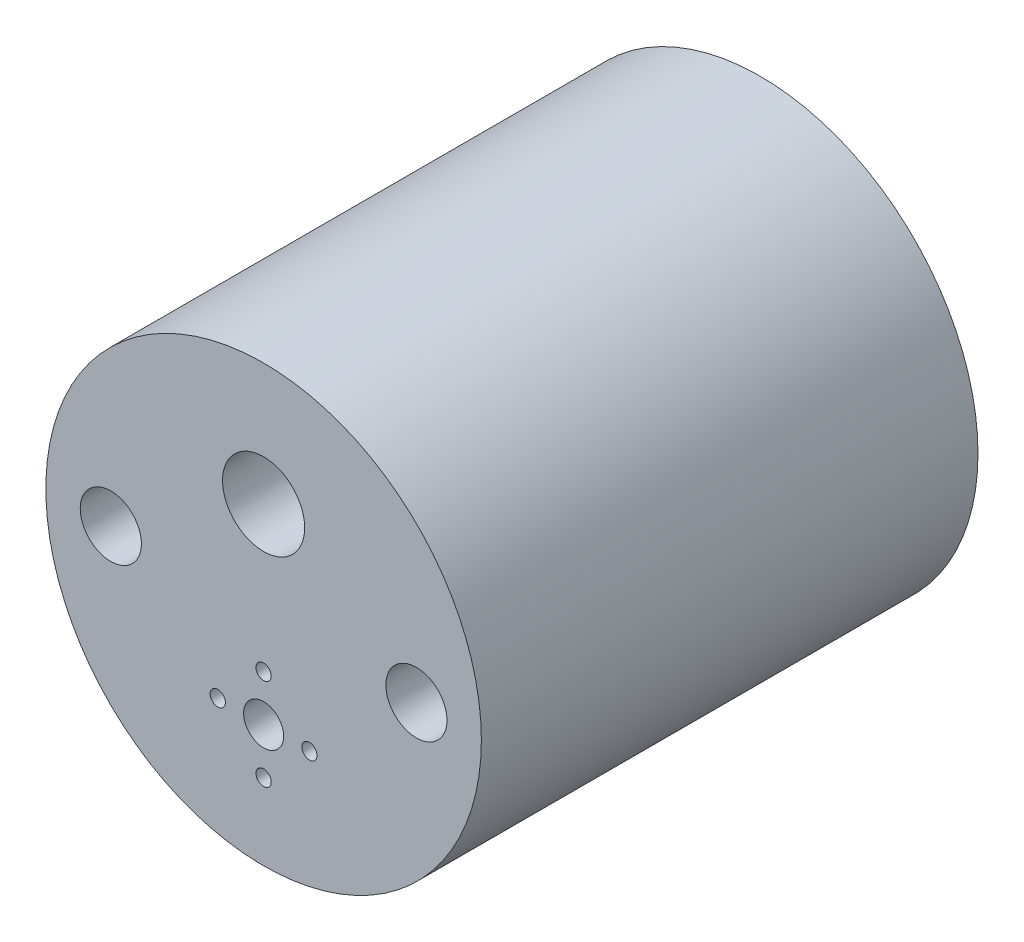
ISO-10303-21;
HEADER;
FILE_DESCRIPTION(('STEP AP214'),'2;1');
FILE_NAME('part.step','',(''),(''),'','','');
FILE_SCHEMA(('AUTOMOTIVE_DESIGN { 1 0 10303 214 1 1 1 1 }'));
ENDSEC;
DATA;
#1=APPLICATION_CONTEXT('core data for automotive mechanical design processes');
#2=APPLICATION_PROTOCOL_DEFINITION('international standard','automotive_design',2000,#1);
#3=PRODUCT_CONTEXT('',#1,'mechanical');
#4=PRODUCT('Part','Part','',(#3));
#5=PRODUCT_RELATED_PRODUCT_CATEGORY('part','',(#4));
#6=PRODUCT_DEFINITION_FORMATION('','',#4);
#7=PRODUCT_DEFINITION_CONTEXT('part definition',#1,'design');
#8=PRODUCT_DEFINITION('design','',#6,#7);
#9=PRODUCT_DEFINITION_SHAPE('','',#8);
#10=(LENGTH_UNIT() NAMED_UNIT(*) SI_UNIT(.MILLI.,.METRE.));
#11=(NAMED_UNIT(*) PLANE_ANGLE_UNIT() SI_UNIT($,.RADIAN.));
#12=(NAMED_UNIT(*) SI_UNIT($,.STERADIAN.) SOLID_ANGLE_UNIT());
#13=UNCERTAINTY_MEASURE_WITH_UNIT(LENGTH_MEASURE(1.E-05),#10,'distance_accuracy_value','');
#14=(GEOMETRIC_REPRESENTATION_CONTEXT(3) GLOBAL_UNCERTAINTY_ASSIGNED_CONTEXT((#13)) GLOBAL_UNIT_ASSIGNED_CONTEXT((#10,
#11,#12)) REPRESENTATION_CONTEXT('',''));
#15=CARTESIAN_POINT('',(0.,0.,0.));
#16=DIRECTION('',(0.,0.,1.));
#17=DIRECTION('',(1.,0.,0.));
#18=AXIS2_PLACEMENT_3D('',#15,#16,#17);
#19=CARTESIAN_POINT('',(-40.0000000000001,25.0000000000002,-19.5));
#20=DIRECTION('',(0.,0.,1.));
#21=DIRECTION('',(1.,0.,0.));
#22=AXIS2_PLACEMENT_3D('',#19,#20,#21);
#23=CYLINDRICAL_SURFACE('',#22,8.);
#24=CARTESIAN_POINT('',(-40.0000000000001,25.0000000000002,0.));
#25=DIRECTION('',(0.,0.,-1.));
#26=DIRECTION('',(-1.,0.,0.));
#27=AXIS2_PLACEMENT_3D('',#24,#25,#26);
#28=CIRCLE('',#27,8.);
#29=CARTESIAN_POINT('',(-48.0000000000001,25.0000000000002,0.));
#30=VERTEX_POINT('',#29);
#31=EDGE_CURVE('E123',#30,#30,#28,.T.);
#32=ORIENTED_EDGE('',*,*,#31,.F.);
#33=EDGE_LOOP('',(#32));
#34=FACE_BOUND('',#33,.T.);
#35=CARTESIAN_POINT('',(-40.0000000000001,25.0000000000002,-13.95));
#36=DIRECTION('',(0.,0.,-1.));
#37=DIRECTION('',(-1.,0.,0.));
#38=AXIS2_PLACEMENT_3D('',#35,#36,#37);
#39=CIRCLE('',#38,8.);
#40=CARTESIAN_POINT('',(-48.0000000000001,25.0000000000002,-13.95));
#41=VERTEX_POINT('',#40);
#42=EDGE_CURVE('E41',#41,#41,#39,.T.);
#43=ORIENTED_EDGE('',*,*,#42,.T.);
#44=EDGE_LOOP('',(#43));
#45=FACE_BOUND('',#44,.T.);
#46=ADVANCED_FACE('F37',(#34,#45),#23,.F.);
#47=CARTESIAN_POINT('',(40.0000000000001,25.0000000000002,-19.5));
#48=DIRECTION('',(0.,0.,1.));
#49=DIRECTION('',(1.,0.,0.));
#50=AXIS2_PLACEMENT_3D('',#47,#48,#49);
#51=CYLINDRICAL_SURFACE('',#50,8.);
#52=CARTESIAN_POINT('',(40.0000000000001,25.0000000000002,0.));
#53=DIRECTION('',(0.,0.,1.));
#54=DIRECTION('',(1.,0.,0.));
#55=AXIS2_PLACEMENT_3D('',#52,#53,#54);
#56=CIRCLE('',#55,8.);
#57=CARTESIAN_POINT('',(48.0000000000001,25.0000000000002,0.));
#58=VERTEX_POINT('',#57);
#59=EDGE_CURVE('E107',#58,#58,#56,.T.);
#60=ORIENTED_EDGE('',*,*,#59,.T.);
#61=EDGE_LOOP('',(#60));
#62=FACE_BOUND('',#61,.T.);
#63=CARTESIAN_POINT('',(40.0000000000001,25.0000000000002,-13.95));
#64=DIRECTION('',(0.,0.,-1.));
#65=DIRECTION('',(-1.,0.,0.));
#66=AXIS2_PLACEMENT_3D('',#63,#64,#65);
#67=CIRCLE('',#66,8.);
#68=CARTESIAN_POINT('',(32.0000000000001,25.0000000000002,-13.95));
#69=VERTEX_POINT('',#68);
#70=EDGE_CURVE('E104',#69,#69,#67,.F.);
#71=ORIENTED_EDGE('',*,*,#70,.F.);
#72=EDGE_LOOP('',(#71));
#73=FACE_BOUND('',#72,.T.);
#74=ADVANCED_FACE('F152',(#62,#73),#51,.F.);
#75=CARTESIAN_POINT('',(1.21430643318376E-13,25.0000000000002,-20.));
#76=DIRECTION('',(0.,0.,1.));
#77=DIRECTION('',(1.,0.,0.));
#78=AXIS2_PLACEMENT_3D('',#75,#76,#77);
#79=PLANE('',#78);
#80=CARTESIAN_POINT('',(-40.0000000000001,25.0000000000002,-20.));
#81=DIRECTION('',(0.,0.,1.));
#82=DIRECTION('',(1.,0.,0.));
#83=AXIS2_PLACEMENT_3D('',#80,#81,#82);
#84=CIRCLE('',#83,12.);
#85=CARTESIAN_POINT('',(-28.0000000000001,25.0000000000002,-20.));
#86=VERTEX_POINT('',#85);
#87=EDGE_CURVE('E306',#86,#86,#84,.T.);
#88=ORIENTED_EDGE('',*,*,#87,.T.);
#89=EDGE_LOOP('',(#88));
#90=FACE_BOUND('',#89,.T.);
#91=CARTESIAN_POINT('',(40.0000000000001,25.0000000000002,-20.));
#92=DIRECTION('',(0.,0.,-1.));
#93=DIRECTION('',(-1.,0.,0.));
#94=AXIS2_PLACEMENT_3D('',#91,#92,#93);
#95=CIRCLE('',#94,12.);
#96=CARTESIAN_POINT('',(28.0000000000001,25.0000000000002,-20.));
#97=VERTEX_POINT('',#96);
#98=EDGE_CURVE('E117',#97,#97,#95,.T.);
#99=ORIENTED_EDGE('',*,*,#98,.F.);
#100=EDGE_LOOP('',(#99));
#101=FACE_BOUND('',#100,.T.);
#102=CARTESIAN_POINT('',(12.,3.35012001030228E-13,-20.));
#103=DIRECTION('',(0.,0.,1.));
#104=DIRECTION('',(1.,0.,0.));
#105=AXIS2_PLACEMENT_3D('',#102,#103,#104);
#106=CIRCLE('',#105,2.);
#107=CARTESIAN_POINT('',(14.,3.35012001030228E-13,-20.));
#108=VERTEX_POINT('',#107);
#109=EDGE_CURVE('E52',#108,#108,#106,.T.);
#110=ORIENTED_EDGE('',*,*,#109,.T.);
#111=EDGE_LOOP('',(#110));
#112=FACE_BOUND('',#111,.T.);
#113=CARTESIAN_POINT('',(3.4386235695337E-13,-11.9999999999997,-20.));
#114=DIRECTION('',(0.,0.,1.));
#115=DIRECTION('',(1.,0.,0.));
#116=AXIS2_PLACEMENT_3D('',#113,#114,#115);
#117=CIRCLE('',#116,2.);
#118=CARTESIAN_POINT('',(2.00000000000034,-11.9999999999997,-20.));
#119=VERTEX_POINT('',#118);
#120=EDGE_CURVE('E91',#119,#119,#117,.T.);
#121=ORIENTED_EDGE('',*,*,#120,.T.);
#122=EDGE_LOOP('',(#121));
#123=FACE_BOUND('',#122,.T.);
#124=CARTESIAN_POINT('',(-11.9999999999997,0.,-20.));
#125=DIRECTION('',(0.,0.,1.));
#126=DIRECTION('',(1.,0.,0.));
#127=AXIS2_PLACEMENT_3D('',#124,#125,#126);
#128=CIRCLE('',#127,2.);
#129=CARTESIAN_POINT('',(-9.99999999999966,0.,-20.));
#130=VERTEX_POINT('',#129);
#131=EDGE_CURVE('E83',#130,#130,#128,.T.);
#132=ORIENTED_EDGE('',*,*,#131,.T.);
#133=EDGE_LOOP('',(#132));
#134=FACE_BOUND('',#133,.T.);
#135=CARTESIAN_POINT('',(0.,0.,-20.));
#136=DIRECTION('',(0.,0.,1.));
#137=DIRECTION('',(1.,0.,0.));
#138=AXIS2_PLACEMENT_3D('',#135,#136,#137);
#139=CIRCLE('',#138,5.25);
#140=CARTESIAN_POINT('',(5.25,0.,-20.));
#141=VERTEX_POINT('',#140);
#142=EDGE_CURVE('E75',#141,#141,#139,.T.);
#143=ORIENTED_EDGE('',*,*,#142,.T.);
#144=EDGE_LOOP('',(#143));
#145=FACE_BOUND('',#144,.T.);
#146=CARTESIAN_POINT('',(0.,12.,-20.));
#147=DIRECTION('',(0.,0.,1.));
#148=DIRECTION('',(1.,0.,0.));
#149=AXIS2_PLACEMENT_3D('',#146,#147,#148);
#150=CIRCLE('',#149,2.);
#151=CARTESIAN_POINT('',(2.,12.,-20.));
#152=VERTEX_POINT('',#151);
#153=EDGE_CURVE('E67',#152,#152,#150,.T.);
#154=ORIENTED_EDGE('',*,*,#153,.T.);
#155=EDGE_LOOP('',(#154));
#156=FACE_BOUND('',#155,.T.);
#157=CARTESIAN_POINT('',(-5.58908946435649E-12,50.0000000000008,-20.));
#158=DIRECTION('',(0.,0.,1.));
#159=DIRECTION('',(1.,0.,0.));
#160=AXIS2_PLACEMENT_3D('',#157,#158,#159);
#161=CIRCLE('',#160,10.7500000000053);
#162=CARTESIAN_POINT('',(10.7499999999997,50.0000000000008,-20.));
#163=VERTEX_POINT('',#162);
#164=EDGE_CURVE('E58',#163,#163,#161,.T.);
#165=ORIENTED_EDGE('',*,*,#164,.T.);
#166=EDGE_LOOP('',(#165));
#167=FACE_BOUND('',#166,.T.);
#168=CARTESIAN_POINT('',(1.21430643318376E-13,25.0000000000002,-20.));
#169=DIRECTION('',(0.,0.,1.));
#170=DIRECTION('',(1.,0.,0.));
#171=AXIS2_PLACEMENT_3D('',#168,#169,#170);
#172=CIRCLE('',#171,54.);
#173=CARTESIAN_POINT('',(54.0000000000001,25.0000000000002,-20.));
#174=VERTEX_POINT('',#173);
#175=EDGE_CURVE('E10',#174,#174,#172,.T.);
#176=ORIENTED_EDGE('',*,*,#175,.F.);
#177=EDGE_LOOP('',(#176));
#178=FACE_BOUND('',#177,.T.);
#179=ADVANCED_FACE('F158',(#90,#101,#112,#123,#134,#145,#156,#167,#178),#79,.F.);
#180=CARTESIAN_POINT('',(1.21430643318376E-13,25.0000000000002,-20.));
#181=DIRECTION('',(0.,0.,1.));
#182=DIRECTION('',(1.,0.,0.));
#183=AXIS2_PLACEMENT_3D('',#180,#181,#182);
#184=CYLINDRICAL_SURFACE('',#183,57.);
#185=CARTESIAN_POINT('',(1.21430643318376E-13,25.0000000000002,0.));
#186=DIRECTION('',(0.,0.,1.));
#187=DIRECTION('',(1.,0.,0.));
#188=AXIS2_PLACEMENT_3D('',#185,#186,#187);
#189=CIRCLE('',#188,57.);
#190=CARTESIAN_POINT('',(57.0000000000001,25.0000000000002,0.));
#191=VERTEX_POINT('',#190);
#192=EDGE_CURVE('E46',#191,#191,#189,.T.);
#193=ORIENTED_EDGE('',*,*,#192,.F.);
#194=EDGE_LOOP('',(#193));
#195=FACE_BOUND('',#194,.T.);
#196=CARTESIAN_POINT('',(1.21430643318376E-13,25.0000000000002,-130.));
#197=DIRECTION('',(0.,0.,1.));
#198=DIRECTION('',(1.,0.,0.));
#199=AXIS2_PLACEMENT_3D('',#196,#197,#198);
#200=CIRCLE('',#199,57.);
#201=CARTESIAN_POINT('',(57.0000000000001,25.0000000000002,-130.));
#202=VERTEX_POINT('',#201);
#203=EDGE_CURVE('E56',#202,#202,#200,.T.);
#204=ORIENTED_EDGE('',*,*,#203,.T.);
#205=EDGE_LOOP('',(#204));
#206=FACE_BOUND('',#205,.T.);
#207=ADVANCED_FACE('F39',(#195,#206),#184,.T.);
#208=CARTESIAN_POINT('',(1.21430643318376E-13,25.0000000000002,0.));
#209=DIRECTION('',(0.,0.,1.));
#210=DIRECTION('',(1.,0.,0.));
#211=AXIS2_PLACEMENT_3D('',#208,#209,#210);
#212=PLANE('',#211);
#213=ORIENTED_EDGE('',*,*,#31,.T.);
#214=EDGE_LOOP('',(#213));
#215=FACE_BOUND('',#214,.T.);
#216=ORIENTED_EDGE('',*,*,#59,.F.);
#217=EDGE_LOOP('',(#216));
#218=FACE_BOUND('',#217,.T.);
#219=ORIENTED_EDGE('',*,*,#192,.T.);
#220=EDGE_LOOP('',(#219));
#221=FACE_BOUND('',#220,.T.);
#222=CARTESIAN_POINT('',(12.,3.35012001030228E-13,0.));
#223=DIRECTION('',(0.,0.,1.));
#224=DIRECTION('',(1.,0.,0.));
#225=AXIS2_PLACEMENT_3D('',#222,#223,#224);
#226=CIRCLE('',#225,2.);
#227=CARTESIAN_POINT('',(14.,3.35012001030228E-13,0.));
#228=VERTEX_POINT('',#227);
#229=EDGE_CURVE('E95',#228,#228,#226,.T.);
#230=ORIENTED_EDGE('',*,*,#229,.F.);
#231=EDGE_LOOP('',(#230));
#232=FACE_BOUND('',#231,.T.);
#233=CARTESIAN_POINT('',(3.4386235695337E-13,-11.9999999999997,0.));
#234=DIRECTION('',(0.,0.,1.));
#235=DIRECTION('',(1.,0.,0.));
#236=AXIS2_PLACEMENT_3D('',#233,#234,#235);
#237=CIRCLE('',#236,2.);
#238=CARTESIAN_POINT('',(2.00000000000034,-11.9999999999997,0.));
#239=VERTEX_POINT('',#238);
#240=EDGE_CURVE('E87',#239,#239,#237,.T.);
#241=ORIENTED_EDGE('',*,*,#240,.F.);
#242=EDGE_LOOP('',(#241));
#243=FACE_BOUND('',#242,.T.);
#244=CARTESIAN_POINT('',(-11.9999999999997,0.,0.));
#245=DIRECTION('',(0.,0.,1.));
#246=DIRECTION('',(1.,0.,0.));
#247=AXIS2_PLACEMENT_3D('',#244,#245,#246);
#248=CIRCLE('',#247,2.);
#249=CARTESIAN_POINT('',(-9.99999999999966,0.,0.));
#250=VERTEX_POINT('',#249);
#251=EDGE_CURVE('E79',#250,#250,#248,.T.);
#252=ORIENTED_EDGE('',*,*,#251,.F.);
#253=EDGE_LOOP('',(#252));
#254=FACE_BOUND('',#253,.T.);
#255=CARTESIAN_POINT('',(0.,0.,0.));
#256=DIRECTION('',(0.,0.,1.));
#257=DIRECTION('',(1.,0.,0.));
#258=AXIS2_PLACEMENT_3D('',#255,#256,#257);
#259=CIRCLE('',#258,5.25);
#260=CARTESIAN_POINT('',(5.25,0.,0.));
#261=VERTEX_POINT('',#260);
#262=EDGE_CURVE('E71',#261,#261,#259,.T.);
#263=ORIENTED_EDGE('',*,*,#262,.F.);
#264=EDGE_LOOP('',(#263));
#265=FACE_BOUND('',#264,.T.);
#266=CARTESIAN_POINT('',(0.,12.,0.));
#267=DIRECTION('',(0.,0.,1.));
#268=DIRECTION('',(1.,0.,0.));
#269=AXIS2_PLACEMENT_3D('',#266,#267,#268);
#270=CIRCLE('',#269,2.);
#271=CARTESIAN_POINT('',(2.,12.,0.));
#272=VERTEX_POINT('',#271);
#273=EDGE_CURVE('E62',#272,#272,#270,.T.);
#274=ORIENTED_EDGE('',*,*,#273,.F.);
#275=EDGE_LOOP('',(#274));
#276=FACE_BOUND('',#275,.T.);
#277=CARTESIAN_POINT('',(-5.58908946435649E-12,50.0000000000008,0.));
#278=DIRECTION('',(0.,0.,1.));
#279=DIRECTION('',(1.,0.,0.));
#280=AXIS2_PLACEMENT_3D('',#277,#278,#279);
#281=CIRCLE('',#280,10.7500000000053);
#282=CARTESIAN_POINT('',(10.7499999999997,50.0000000000008,0.));
#283=VERTEX_POINT('',#282);
#284=EDGE_CURVE('E63',#283,#283,#281,.T.);
#285=ORIENTED_EDGE('',*,*,#284,.F.);
#286=EDGE_LOOP('',(#285));
#287=FACE_BOUND('',#286,.T.);
#288=ADVANCED_FACE('F199',(#215,#218,#221,#232,#243,#254,#265,#276,#287),#212,.T.);
#289=CARTESIAN_POINT('',(12.,3.35012001030228E-13,-20.));
#290=DIRECTION('',(0.,0.,1.));
#291=DIRECTION('',(1.,0.,0.));
#292=AXIS2_PLACEMENT_3D('',#289,#290,#291);
#293=CYLINDRICAL_SURFACE('',#292,2.);
#294=ORIENTED_EDGE('',*,*,#109,.F.);
#295=EDGE_LOOP('',(#294));
#296=FACE_BOUND('',#295,.T.);
#297=ORIENTED_EDGE('',*,*,#229,.T.);
#298=EDGE_LOOP('',(#297));
#299=FACE_BOUND('',#298,.T.);
#300=ADVANCED_FACE('F201',(#296,#299),#293,.F.);
#301=CARTESIAN_POINT('',(3.4386235695337E-13,-11.9999999999997,-20.));
#302=DIRECTION('',(0.,0.,1.));
#303=DIRECTION('',(1.,0.,0.));
#304=AXIS2_PLACEMENT_3D('',#301,#302,#303);
#305=CYLINDRICAL_SURFACE('',#304,2.);
#306=ORIENTED_EDGE('',*,*,#120,.F.);
#307=EDGE_LOOP('',(#306));
#308=FACE_BOUND('',#307,.T.);
#309=ORIENTED_EDGE('',*,*,#240,.T.);
#310=EDGE_LOOP('',(#309));
#311=FACE_BOUND('',#310,.T.);
#312=ADVANCED_FACE('F207',(#308,#311),#305,.F.);
#313=CARTESIAN_POINT('',(-11.9999999999997,0.,-20.));
#314=DIRECTION('',(0.,0.,1.));
#315=DIRECTION('',(1.,0.,0.));
#316=AXIS2_PLACEMENT_3D('',#313,#314,#315);
#317=CYLINDRICAL_SURFACE('',#316,2.);
#318=ORIENTED_EDGE('',*,*,#131,.F.);
#319=EDGE_LOOP('',(#318));
#320=FACE_BOUND('',#319,.T.);
#321=ORIENTED_EDGE('',*,*,#251,.T.);
#322=EDGE_LOOP('',(#321));
#323=FACE_BOUND('',#322,.T.);
#324=ADVANCED_FACE('F216',(#320,#323),#317,.F.);
#325=CARTESIAN_POINT('',(0.,0.,-20.));
#326=DIRECTION('',(0.,0.,1.));
#327=DIRECTION('',(1.,0.,0.));
#328=AXIS2_PLACEMENT_3D('',#325,#326,#327);
#329=CYLINDRICAL_SURFACE('',#328,5.25);
#330=ORIENTED_EDGE('',*,*,#142,.F.);
#331=EDGE_LOOP('',(#330));
#332=FACE_BOUND('',#331,.T.);
#333=ORIENTED_EDGE('',*,*,#262,.T.);
#334=EDGE_LOOP('',(#333));
#335=FACE_BOUND('',#334,.T.);
#336=ADVANCED_FACE('F220',(#332,#335),#329,.F.);
#337=CARTESIAN_POINT('',(0.,12.,-20.));
#338=DIRECTION('',(0.,0.,1.));
#339=DIRECTION('',(1.,0.,0.));
#340=AXIS2_PLACEMENT_3D('',#337,#338,#339);
#341=CYLINDRICAL_SURFACE('',#340,2.);
#342=ORIENTED_EDGE('',*,*,#153,.F.);
#343=EDGE_LOOP('',(#342));
#344=FACE_BOUND('',#343,.T.);
#345=ORIENTED_EDGE('',*,*,#273,.T.);
#346=EDGE_LOOP('',(#345));
#347=FACE_BOUND('',#346,.T.);
#348=ADVANCED_FACE('F196',(#344,#347),#341,.F.);
#349=CARTESIAN_POINT('',(-5.58908946435649E-12,50.0000000000008,-20.));
#350=DIRECTION('',(0.,0.,1.));
#351=DIRECTION('',(1.,0.,0.));
#352=AXIS2_PLACEMENT_3D('',#349,#350,#351);
#353=CYLINDRICAL_SURFACE('',#352,10.7500000000053);
#354=ORIENTED_EDGE('',*,*,#164,.F.);
#355=EDGE_LOOP('',(#354));
#356=FACE_BOUND('',#355,.T.);
#357=ORIENTED_EDGE('',*,*,#284,.T.);
#358=EDGE_LOOP('',(#357));
#359=FACE_BOUND('',#358,.T.);
#360=ADVANCED_FACE('F147',(#356,#359),#353,.F.);
#361=CARTESIAN_POINT('',(1.21430643318376E-13,25.0000000000002,-130.));
#362=DIRECTION('',(0.,0.,1.));
#363=DIRECTION('',(1.,0.,0.));
#364=AXIS2_PLACEMENT_3D('',#361,#362,#363);
#365=CYLINDRICAL_SURFACE('',#364,54.);
#366=CARTESIAN_POINT('',(1.21430643318376E-13,25.0000000000002,-130.));
#367=DIRECTION('',(0.,0.,1.));
#368=DIRECTION('',(1.,0.,0.));
#369=AXIS2_PLACEMENT_3D('',#366,#367,#368);
#370=CIRCLE('',#369,54.);
#371=CARTESIAN_POINT('',(54.0000000000001,25.0000000000002,-130.));
#372=VERTEX_POINT('',#371);
#373=EDGE_CURVE('E114',#372,#372,#370,.T.);
#374=ORIENTED_EDGE('',*,*,#373,.F.);
#375=EDGE_LOOP('',(#374));
#376=FACE_BOUND('',#375,.T.);
#377=ORIENTED_EDGE('',*,*,#175,.T.);
#378=EDGE_LOOP('',(#377));
#379=FACE_BOUND('',#378,.T.);
#380=ADVANCED_FACE('F139',(#376,#379),#365,.F.);
#381=CARTESIAN_POINT('',(1.21430643318376E-13,25.0000000000002,-130.));
#382=DIRECTION('',(0.,0.,1.));
#383=DIRECTION('',(1.,0.,0.));
#384=AXIS2_PLACEMENT_3D('',#381,#382,#383);
#385=PLANE('',#384);
#386=ORIENTED_EDGE('',*,*,#373,.T.);
#387=EDGE_LOOP('',(#386));
#388=FACE_BOUND('',#387,.T.);
#389=ORIENTED_EDGE('',*,*,#203,.F.);
#390=EDGE_LOOP('',(#389));
#391=FACE_BOUND('',#390,.T.);
#392=ADVANCED_FACE('F136',(#388,#391),#385,.F.);
#393=CARTESIAN_POINT('',(40.0000000000001,25.0000000000002,-13.95));
#394=DIRECTION('',(0.,0.,-1.));
#395=DIRECTION('',(-1.,0.,0.));
#396=AXIS2_PLACEMENT_3D('',#393,#394,#395);
#397=PLANE('',#396);
#398=CARTESIAN_POINT('',(40.0000000000001,25.0000000000002,-13.95));
#399=DIRECTION('',(0.,0.,-1.));
#400=DIRECTION('',(-1.,0.,0.));
#401=AXIS2_PLACEMENT_3D('',#398,#399,#400);
#402=CIRCLE('',#401,12.);
#403=CARTESIAN_POINT('',(28.0000000000001,25.0000000000002,-13.95));
#404=VERTEX_POINT('',#403);
#405=EDGE_CURVE('E108',#404,#404,#402,.T.);
#406=ORIENTED_EDGE('',*,*,#405,.T.);
#407=EDGE_LOOP('',(#406));
#408=FACE_BOUND('',#407,.T.);
#409=ORIENTED_EDGE('',*,*,#70,.T.);
#410=EDGE_LOOP('',(#409));
#411=FACE_BOUND('',#410,.T.);
#412=ADVANCED_FACE('F138',(#408,#411),#397,.T.);
#413=CARTESIAN_POINT('',(40.0000000000001,25.0000000000002,-13.95));
#414=DIRECTION('',(0.,0.,-1.));
#415=DIRECTION('',(-1.,0.,0.));
#416=AXIS2_PLACEMENT_3D('',#413,#414,#415);
#417=CYLINDRICAL_SURFACE('',#416,12.);
#418=ORIENTED_EDGE('',*,*,#405,.F.);
#419=EDGE_LOOP('',(#418));
#420=FACE_BOUND('',#419,.T.);
#421=ORIENTED_EDGE('',*,*,#98,.T.);
#422=EDGE_LOOP('',(#421));
#423=FACE_BOUND('',#422,.T.);
#424=ADVANCED_FACE('F145',(#420,#423),#417,.F.);
#425=CARTESIAN_POINT('',(-40.0000000000001,25.0000000000002,-13.95));
#426=DIRECTION('',(0.,0.,-1.));
#427=DIRECTION('',(-1.,0.,0.));
#428=AXIS2_PLACEMENT_3D('',#425,#426,#427);
#429=CYLINDRICAL_SURFACE('',#428,12.);
#430=CARTESIAN_POINT('',(-40.0000000000001,25.0000000000002,-13.95));
#431=DIRECTION('',(0.,0.,1.));
#432=DIRECTION('',(1.,0.,0.));
#433=AXIS2_PLACEMENT_3D('',#430,#431,#432);
#434=CIRCLE('',#433,12.);
#435=CARTESIAN_POINT('',(-28.0000000000001,25.0000000000002,-13.95));
#436=VERTEX_POINT('',#435);
#437=EDGE_CURVE('E304',#436,#436,#434,.T.);
#438=ORIENTED_EDGE('',*,*,#437,.T.);
#439=EDGE_LOOP('',(#438));
#440=FACE_BOUND('',#439,.T.);
#441=ORIENTED_EDGE('',*,*,#87,.F.);
#442=EDGE_LOOP('',(#441));
#443=FACE_BOUND('',#442,.T.);
#444=ADVANCED_FACE('F164',(#440,#443),#429,.F.);
#445=CARTESIAN_POINT('',(-40.0000000000001,25.0000000000002,-13.95));
#446=DIRECTION('',(0.,0.,-1.));
#447=DIRECTION('',(1.,0.,0.));
#448=AXIS2_PLACEMENT_3D('',#445,#446,#447);
#449=PLANE('',#448);
#450=ORIENTED_EDGE('',*,*,#42,.F.);
#451=EDGE_LOOP('',(#450));
#452=FACE_BOUND('',#451,.T.);
#453=ORIENTED_EDGE('',*,*,#437,.F.);
#454=EDGE_LOOP('',(#453));
#455=FACE_BOUND('',#454,.T.);
#456=ADVANCED_FACE('F172',(#452,#455),#449,.T.);
#457=CLOSED_SHELL('',(#46,#74,#179,#207,#288,#300,#312,#324,#336,#348,#360,#380,#392,#412,#424,
#444,#456));
#458=MANIFOLD_SOLID_BREP('B2',#457);
#459=ADVANCED_BREP_SHAPE_REPRESENTATION('',(#18,#458),#14);
#460=SHAPE_DEFINITION_REPRESENTATION(#9,#459);
ENDSEC;
END-ISO-10303-21;
